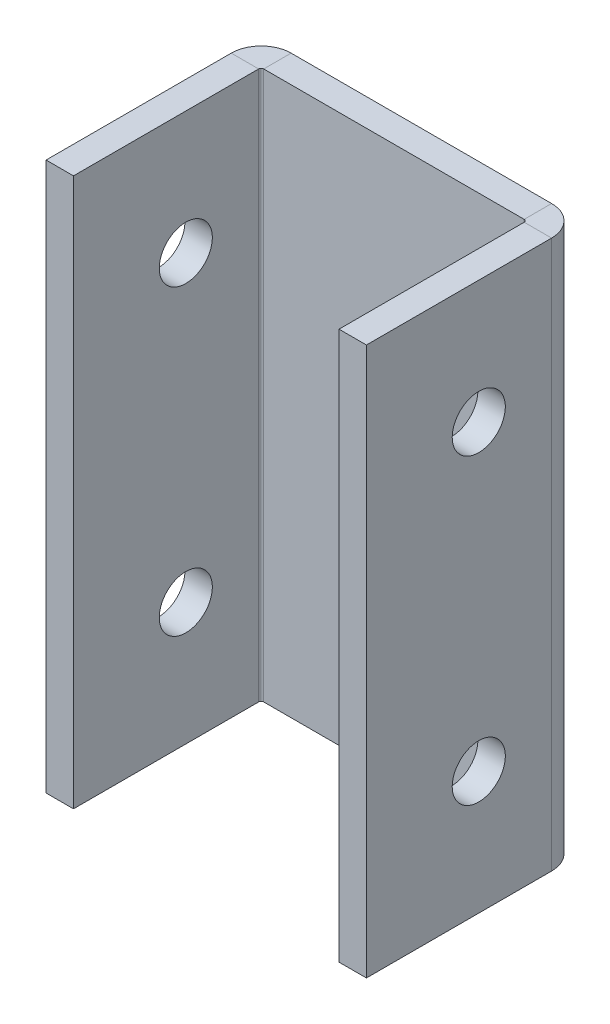
ISO-10303-21;
HEADER;
FILE_DESCRIPTION(('STEP AP214'),'2;1');
FILE_NAME('part.step','',(''),(''),'','','');
FILE_SCHEMA(('AUTOMOTIVE_DESIGN { 1 0 10303 214 1 1 1 1 }'));
ENDSEC;
DATA;
#1=APPLICATION_CONTEXT('core data for automotive mechanical design processes');
#2=APPLICATION_PROTOCOL_DEFINITION('international standard','automotive_design',2000,#1);
#3=PRODUCT_CONTEXT('',#1,'mechanical');
#4=PRODUCT('Part','Part','',(#3));
#5=PRODUCT_RELATED_PRODUCT_CATEGORY('part','',(#4));
#6=PRODUCT_DEFINITION_FORMATION('','',#4);
#7=PRODUCT_DEFINITION_CONTEXT('part definition',#1,'design');
#8=PRODUCT_DEFINITION('design','',#6,#7);
#9=PRODUCT_DEFINITION_SHAPE('','',#8);
#10=(LENGTH_UNIT() NAMED_UNIT(*) SI_UNIT(.MILLI.,.METRE.));
#11=(NAMED_UNIT(*) PLANE_ANGLE_UNIT() SI_UNIT($,.RADIAN.));
#12=(NAMED_UNIT(*) SI_UNIT($,.STERADIAN.) SOLID_ANGLE_UNIT());
#13=UNCERTAINTY_MEASURE_WITH_UNIT(LENGTH_MEASURE(1.E-05),#10,'distance_accuracy_value','');
#14=(GEOMETRIC_REPRESENTATION_CONTEXT(3) GLOBAL_UNCERTAINTY_ASSIGNED_CONTEXT((#13)) GLOBAL_UNIT_ASSIGNED_CONTEXT((#10,
#11,#12)) REPRESENTATION_CONTEXT('',''));
#15=CARTESIAN_POINT('',(0.,0.,0.));
#16=DIRECTION('',(0.,0.,1.));
#17=DIRECTION('',(1.,0.,0.));
#18=AXIS2_PLACEMENT_3D('',#15,#16,#17);
#19=CARTESIAN_POINT('',(0.,0.,0.));
#20=DIRECTION('',(0.,0.,1.));
#21=DIRECTION('',(1.,0.,0.));
#22=AXIS2_PLACEMENT_3D('',#19,#20,#21);
#23=PLANE('',#22);
#24=DIRECTION('',(-1.,0.,0.));
#25=VECTOR('',#24,1.);
#26=CARTESIAN_POINT('',(-91.3672957063712,97.1710526315789,0.));
#27=LINE('',#26,#25);
#28=CARTESIAN_POINT('',(46.1461042936288,97.1710526315789,0.));
#29=VERTEX_POINT('',#28);
#30=CARTESIAN_POINT('',(-29.8806957063713,97.1710526315789,0.));
#31=VERTEX_POINT('',#30);
#32=EDGE_CURVE('E251',#29,#31,#27,.T.);
#33=ORIENTED_EDGE('',*,*,#32,.T.);
#34=DIRECTION('',(0.,-1.,0.));
#35=VECTOR('',#34,1.);
#36=CARTESIAN_POINT('',(-29.8806957063713,0.,0.));
#37=LINE('',#36,#35);
#38=CARTESIAN_POINT('',(-29.8806957063713,-62.8289473684211,0.));
#39=VERTEX_POINT('',#38);
#40=EDGE_CURVE('E55',#31,#39,#37,.T.);
#41=ORIENTED_EDGE('',*,*,#40,.T.);
#42=DIRECTION('',(1.,0.,0.));
#43=VECTOR('',#42,1.);
#44=CARTESIAN_POINT('',(-91.3672957063712,-62.8289473684211,0.));
#45=LINE('',#44,#43);
#46=CARTESIAN_POINT('',(46.1461042936288,-62.8289473684211,0.));
#47=VERTEX_POINT('',#46);
#48=EDGE_CURVE('E71',#39,#47,#45,.T.);
#49=ORIENTED_EDGE('',*,*,#48,.T.);
#50=DIRECTION('',(0.,-1.,0.));
#51=VECTOR('',#50,1.);
#52=CARTESIAN_POINT('',(46.1461042936288,0.,0.));
#53=LINE('',#52,#51);
#54=EDGE_CURVE('E235',#29,#47,#53,.T.);
#55=ORIENTED_EDGE('',*,*,#54,.F.);
#56=EDGE_LOOP('',(#33,#41,#49,#55));
#57=FACE_BOUND('',#56,.T.);
#58=ADVANCED_FACE('F46',(#57),#23,.T.);
#59=CARTESIAN_POINT('',(-91.3672957063712,-62.8289473684211,-8.));
#60=DIRECTION('',(0.,-1.,0.));
#61=DIRECTION('',(0.,0.,-1.));
#62=AXIS2_PLACEMENT_3D('',#59,#60,#61);
#63=PLANE('',#62);
#64=ORIENTED_EDGE('',*,*,#48,.F.);
#65=DIRECTION('',(0.,0.,-1.));
#66=VECTOR('',#65,1.);
#67=CARTESIAN_POINT('',(-29.8806957063713,-62.8289473684211,-8.));
#68=LINE('',#67,#66);
#69=CARTESIAN_POINT('',(-29.8806957063713,-62.8289473684211,-8.));
#70=VERTEX_POINT('',#69);
#71=EDGE_CURVE('E243',#39,#70,#68,.T.);
#72=ORIENTED_EDGE('',*,*,#71,.T.);
#73=DIRECTION('',(1.,0.,0.));
#74=VECTOR('',#73,1.);
#75=CARTESIAN_POINT('',(-91.3672957063712,-62.8289473684211,-8.));
#76=LINE('',#75,#74);
#77=CARTESIAN_POINT('',(46.1461042936288,-62.8289473684211,-8.));
#78=VERTEX_POINT('',#77);
#79=EDGE_CURVE('E249',#70,#78,#76,.T.);
#80=ORIENTED_EDGE('',*,*,#79,.T.);
#81=DIRECTION('',(0.,0.,-1.));
#82=VECTOR('',#81,1.);
#83=CARTESIAN_POINT('',(46.1461042936288,-62.8289473684211,-8.));
#84=LINE('',#83,#82);
#85=EDGE_CURVE('E238',#47,#78,#84,.T.);
#86=ORIENTED_EDGE('',*,*,#85,.F.);
#87=EDGE_LOOP('',(#64,#72,#80,#86));
#88=FACE_BOUND('',#87,.T.);
#89=ADVANCED_FACE('F303',(#88),#63,.T.);
#90=CARTESIAN_POINT('',(-91.3672957063712,97.1710526315789,-8.));
#91=DIRECTION('',(0.,1.,0.));
#92=DIRECTION('',(0.,0.,1.));
#93=AXIS2_PLACEMENT_3D('',#90,#91,#92);
#94=PLANE('',#93);
#95=DIRECTION('',(-1.,0.,0.));
#96=VECTOR('',#95,1.);
#97=CARTESIAN_POINT('',(-91.3672957063712,97.1710526315789,-8.));
#98=LINE('',#97,#96);
#99=CARTESIAN_POINT('',(46.1461042936288,97.1710526315789,-8.));
#100=VERTEX_POINT('',#99);
#101=CARTESIAN_POINT('',(-29.8806957063713,97.1710526315789,-8.));
#102=VERTEX_POINT('',#101);
#103=EDGE_CURVE('E232',#100,#102,#98,.T.);
#104=ORIENTED_EDGE('',*,*,#103,.T.);
#105=DIRECTION('',(0.,0.,1.));
#106=VECTOR('',#105,1.);
#107=CARTESIAN_POINT('',(-29.8806957063713,97.1710526315789,-8.));
#108=LINE('',#107,#106);
#109=EDGE_CURVE('E12',#102,#31,#108,.T.);
#110=ORIENTED_EDGE('',*,*,#109,.T.);
#111=ORIENTED_EDGE('',*,*,#32,.F.);
#112=DIRECTION('',(0.,0.,1.));
#113=VECTOR('',#112,1.);
#114=CARTESIAN_POINT('',(46.1461042936288,97.1710526315789,-8.));
#115=LINE('',#114,#113);
#116=EDGE_CURVE('E231',#100,#29,#115,.T.);
#117=ORIENTED_EDGE('',*,*,#116,.F.);
#118=EDGE_LOOP('',(#104,#110,#111,#117));
#119=FACE_BOUND('',#118,.T.);
#120=ADVANCED_FACE('F48',(#119),#94,.T.);
#121=CARTESIAN_POINT('',(0.,0.,-8.));
#122=DIRECTION('',(0.,0.,1.));
#123=DIRECTION('',(1.,0.,0.));
#124=AXIS2_PLACEMENT_3D('',#121,#122,#123);
#125=PLANE('',#124);
#126=DIRECTION('',(0.,-1.,0.));
#127=VECTOR('',#126,1.);
#128=CARTESIAN_POINT('',(-29.8806957063713,0.,-8.));
#129=LINE('',#128,#127);
#130=EDGE_CURVE('E241',#102,#70,#129,.T.);
#131=ORIENTED_EDGE('',*,*,#130,.F.);
#132=ORIENTED_EDGE('',*,*,#103,.F.);
#133=DIRECTION('',(0.,-1.,0.));
#134=VECTOR('',#133,1.);
#135=CARTESIAN_POINT('',(46.1461042936288,0.,-8.));
#136=LINE('',#135,#134);
#137=EDGE_CURVE('E229',#100,#78,#136,.T.);
#138=ORIENTED_EDGE('',*,*,#137,.T.);
#139=ORIENTED_EDGE('',*,*,#79,.F.);
#140=EDGE_LOOP('',(#131,#132,#138,#139));
#141=FACE_BOUND('',#140,.T.);
#142=ADVANCED_FACE('F290',(#141),#125,.F.);
#143=CARTESIAN_POINT('',(46.1461042936288,97.1710526315789,0.7366));
#144=DIRECTION('',(0.,1.,0.));
#145=DIRECTION('',(0.,0.,1.));
#146=AXIS2_PLACEMENT_3D('',#143,#144,#145);
#147=PLANE('',#146);
#148=ORIENTED_EDGE('',*,*,#116,.T.);
#149=CARTESIAN_POINT('',(46.1461042936288,97.1710526315789,0.7366));
#150=DIRECTION('',(0.,-1.,0.));
#151=DIRECTION('',(0.,0.,-1.));
#152=AXIS2_PLACEMENT_3D('',#149,#150,#151);
#153=CIRCLE('',#152,0.7366);
#154=CARTESIAN_POINT('',(46.8827042936288,97.1710526315789,0.736599999999976));
#155=VERTEX_POINT('',#154);
#156=EDGE_CURVE('E190',#29,#155,#153,.T.);
#157=ORIENTED_EDGE('',*,*,#156,.T.);
#158=DIRECTION('',(-1.,0.,0.));
#159=VECTOR('',#158,1.);
#160=CARTESIAN_POINT('',(54.8827042936288,97.1710526315789,0.736600000000004));
#161=LINE('',#160,#159);
#162=CARTESIAN_POINT('',(54.8827042936288,97.1710526315789,0.736600000000004));
#163=VERTEX_POINT('',#162);
#164=EDGE_CURVE('E205',#163,#155,#161,.T.);
#165=ORIENTED_EDGE('',*,*,#164,.F.);
#166=CARTESIAN_POINT('',(46.1461042936288,97.1710526315789,0.7366));
#167=DIRECTION('',(0.,-1.,0.));
#168=DIRECTION('',(0.,0.,1.));
#169=AXIS2_PLACEMENT_3D('',#166,#167,#168);
#170=CIRCLE('',#169,8.7366);
#171=EDGE_CURVE('E218',#100,#163,#170,.T.);
#172=ORIENTED_EDGE('',*,*,#171,.F.);
#173=EDGE_LOOP('',(#148,#157,#165,#172));
#174=FACE_BOUND('',#173,.T.);
#175=ADVANCED_FACE('F298',(#174),#147,.T.);
#176=CARTESIAN_POINT('',(46.1461042936288,-62.8289473684211,0.7366));
#177=DIRECTION('',(0.,-1.,0.));
#178=DIRECTION('',(0.,0.,-1.));
#179=AXIS2_PLACEMENT_3D('',#176,#177,#178);
#180=PLANE('',#179);
#181=DIRECTION('',(1.,0.,0.));
#182=VECTOR('',#181,1.);
#183=CARTESIAN_POINT('',(54.8827042936288,-62.8289473684211,0.736600000000032));
#184=LINE('',#183,#182);
#185=CARTESIAN_POINT('',(46.8827042936288,-62.8289473684211,0.736600000000004));
#186=VERTEX_POINT('',#185);
#187=CARTESIAN_POINT('',(54.8827042936288,-62.8289473684211,0.736600000000037));
#188=VERTEX_POINT('',#187);
#189=EDGE_CURVE('E193',#186,#188,#184,.T.);
#190=ORIENTED_EDGE('',*,*,#189,.F.);
#191=CARTESIAN_POINT('',(46.1461042936288,-62.8289473684211,0.7366));
#192=DIRECTION('',(0.,-1.,0.));
#193=DIRECTION('',(0.,0.,-1.));
#194=AXIS2_PLACEMENT_3D('',#191,#192,#193);
#195=CIRCLE('',#194,0.7366);
#196=EDGE_CURVE('E222',#186,#47,#195,.F.);
#197=ORIENTED_EDGE('',*,*,#196,.T.);
#198=ORIENTED_EDGE('',*,*,#85,.T.);
#199=CARTESIAN_POINT('',(46.1461042936288,-62.8289473684211,0.7366));
#200=DIRECTION('',(0.,1.,0.));
#201=DIRECTION('',(0.,0.,-1.));
#202=AXIS2_PLACEMENT_3D('',#199,#200,#201);
#203=CIRCLE('',#202,8.7366);
#204=EDGE_CURVE('E221',#188,#78,#203,.T.);
#205=ORIENTED_EDGE('',*,*,#204,.F.);
#206=EDGE_LOOP('',(#190,#197,#198,#205));
#207=FACE_BOUND('',#206,.T.);
#208=ADVANCED_FACE('F306',(#207),#180,.T.);
#209=CARTESIAN_POINT('',(46.1461042936288,177.543609760944,0.7366));
#210=DIRECTION('',(0.,-1.,0.));
#211=DIRECTION('',(0.,0.,-1.));
#212=AXIS2_PLACEMENT_3D('',#209,#210,#211);
#213=CYLINDRICAL_SURFACE('',#212,8.7366);
#214=ORIENTED_EDGE('',*,*,#204,.T.);
#215=ORIENTED_EDGE('',*,*,#137,.F.);
#216=ORIENTED_EDGE('',*,*,#171,.T.);
#217=DIRECTION('',(0.,-1.,0.));
#218=VECTOR('',#217,1.);
#219=CARTESIAN_POINT('',(54.8827042936288,0.,0.736600000000018));
#220=LINE('',#219,#218);
#221=EDGE_CURVE('E183',#163,#188,#220,.T.);
#222=ORIENTED_EDGE('',*,*,#221,.T.);
#223=EDGE_LOOP('',(#214,#215,#216,#222));
#224=FACE_BOUND('',#223,.T.);
#225=ADVANCED_FACE('F300',(#224),#213,.T.);
#226=CARTESIAN_POINT('',(46.1461042936288,177.543609760944,0.7366));
#227=DIRECTION('',(0.,-1.,0.));
#228=DIRECTION('',(0.,0.,-1.));
#229=AXIS2_PLACEMENT_3D('',#226,#227,#228);
#230=CYLINDRICAL_SURFACE('',#229,0.7366);
#231=ORIENTED_EDGE('',*,*,#196,.F.);
#232=DIRECTION('',(0.,-1.,0.));
#233=VECTOR('',#232,1.);
#234=CARTESIAN_POINT('',(46.8827042936288,0.,0.73659999999999));
#235=LINE('',#234,#233);
#236=EDGE_CURVE('E200',#155,#186,#235,.T.);
#237=ORIENTED_EDGE('',*,*,#236,.F.);
#238=ORIENTED_EDGE('',*,*,#156,.F.);
#239=ORIENTED_EDGE('',*,*,#54,.T.);
#240=EDGE_LOOP('',(#231,#237,#238,#239));
#241=FACE_BOUND('',#240,.T.);
#242=ADVANCED_FACE('F310',(#241),#230,.F.);
#243=CARTESIAN_POINT('',(54.8827042936286,97.1710526315789,54.7829661185033));
#244=DIRECTION('',(0.,0.,1.));
#245=DIRECTION('',(0.,1.,0.));
#246=AXIS2_PLACEMENT_3D('',#243,#244,#245);
#247=PLANE('',#246);
#248=DIRECTION('',(0.,1.,0.));
#249=VECTOR('',#248,1.);
#250=CARTESIAN_POINT('',(46.8827042936286,97.1710526315789,54.7829661185033));
#251=LINE('',#250,#249);
#252=CARTESIAN_POINT('',(46.8827042936286,-62.8289473684211,54.7829661185033));
#253=VERTEX_POINT('',#252);
#254=CARTESIAN_POINT('',(46.8827042936286,97.1710526315789,54.7829661185033));
#255=VERTEX_POINT('',#254);
#256=EDGE_CURVE('E195',#253,#255,#251,.T.);
#257=ORIENTED_EDGE('',*,*,#256,.F.);
#258=DIRECTION('',(-1.,0.,0.));
#259=VECTOR('',#258,1.);
#260=CARTESIAN_POINT('',(54.8827042936286,-62.8289473684211,54.7829661185033));
#261=LINE('',#260,#259);
#262=CARTESIAN_POINT('',(54.8827042936286,-62.8289473684211,54.7829661185033));
#263=VERTEX_POINT('',#262);
#264=EDGE_CURVE('E187',#263,#253,#261,.T.);
#265=ORIENTED_EDGE('',*,*,#264,.F.);
#266=DIRECTION('',(0.,1.,0.));
#267=VECTOR('',#266,1.);
#268=CARTESIAN_POINT('',(54.8827042936286,97.1710526315789,54.7829661185033));
#269=LINE('',#268,#267);
#270=CARTESIAN_POINT('',(54.8827042936286,97.1710526315789,54.7829661185033));
#271=VERTEX_POINT('',#270);
#272=EDGE_CURVE('E213',#263,#271,#269,.T.);
#273=ORIENTED_EDGE('',*,*,#272,.T.);
#274=DIRECTION('',(-1.,0.,0.));
#275=VECTOR('',#274,1.);
#276=CARTESIAN_POINT('',(54.8827042936286,97.1710526315789,54.7829661185033));
#277=LINE('',#276,#275);
#278=EDGE_CURVE('E211',#271,#255,#277,.T.);
#279=ORIENTED_EDGE('',*,*,#278,.T.);
#280=EDGE_LOOP('',(#257,#265,#273,#279));
#281=FACE_BOUND('',#280,.T.);
#282=ADVANCED_FACE('F343',(#281),#247,.T.);
#283=CARTESIAN_POINT('',(54.882704293629,0.,-52.8497381751255));
#284=DIRECTION('',(-1.,0.,0.));
#285=DIRECTION('',(0.,0.,1.));
#286=AXIS2_PLACEMENT_3D('',#283,#284,#285);
#287=PLANE('',#286);
#288=CARTESIAN_POINT('',(54.8827042936289,-26.9789473684211,21.9999999999997));
#289=DIRECTION('',(-1.,0.,0.));
#290=DIRECTION('',(0.,0.,1.));
#291=AXIS2_PLACEMENT_3D('',#288,#289,#290);
#292=CIRCLE('',#291,7.74999999999998);
#293=CARTESIAN_POINT('',(54.8827042936289,-26.9789473684211,29.7499999999997));
#294=VERTEX_POINT('',#293);
#295=EDGE_CURVE('E598',#294,#294,#292,.T.);
#296=ORIENTED_EDGE('',*,*,#295,.T.);
#297=EDGE_LOOP('',(#296));
#298=FACE_BOUND('',#297,.T.);
#299=CARTESIAN_POINT('',(54.8827042936289,61.3210526315789,21.9999999999997));
#300=DIRECTION('',(-1.,0.,0.));
#301=DIRECTION('',(0.,0.,1.));
#302=AXIS2_PLACEMENT_3D('',#299,#300,#301);
#303=CIRCLE('',#302,7.74999999999998);
#304=CARTESIAN_POINT('',(54.8827042936289,61.3210526315789,29.7499999999997));
#305=VERTEX_POINT('',#304);
#306=EDGE_CURVE('E257',#305,#305,#303,.T.);
#307=ORIENTED_EDGE('',*,*,#306,.T.);
#308=EDGE_LOOP('',(#307));
#309=FACE_BOUND('',#308,.T.);
#310=ORIENTED_EDGE('',*,*,#221,.F.);
#311=DIRECTION('',(0.,0.,-1.));
#312=VECTOR('',#311,1.);
#313=CARTESIAN_POINT('',(54.8827042936293,97.1710526315789,-144.217033881497));
#314=LINE('',#313,#312);
#315=EDGE_CURVE('E208',#271,#163,#314,.T.);
#316=ORIENTED_EDGE('',*,*,#315,.F.);
#317=ORIENTED_EDGE('',*,*,#272,.F.);
#318=DIRECTION('',(0.,0.,1.));
#319=VECTOR('',#318,1.);
#320=CARTESIAN_POINT('',(54.8827042936293,-62.8289473684211,-144.217033881497));
#321=LINE('',#320,#319);
#322=EDGE_CURVE('E191',#188,#263,#321,.T.);
#323=ORIENTED_EDGE('',*,*,#322,.F.);
#324=EDGE_LOOP('',(#310,#316,#317,#323));
#325=FACE_BOUND('',#324,.T.);
#326=ADVANCED_FACE('F352',(#298,#309,#325),#287,.F.);
#327=CARTESIAN_POINT('',(54.8827042936293,97.1710526315789,-144.217033881497));
#328=DIRECTION('',(0.,1.,0.));
#329=DIRECTION('',(-1.,0.,0.));
#330=AXIS2_PLACEMENT_3D('',#327,#328,#329);
#331=PLANE('',#330);
#332=ORIENTED_EDGE('',*,*,#315,.T.);
#333=ORIENTED_EDGE('',*,*,#164,.T.);
#334=DIRECTION('',(0.,0.,-1.));
#335=VECTOR('',#334,1.);
#336=CARTESIAN_POINT('',(46.8827042936293,97.1710526315789,-144.217033881497));
#337=LINE('',#336,#335);
#338=EDGE_CURVE('E203',#255,#155,#337,.T.);
#339=ORIENTED_EDGE('',*,*,#338,.F.);
#340=ORIENTED_EDGE('',*,*,#278,.F.);
#341=EDGE_LOOP('',(#332,#333,#339,#340));
#342=FACE_BOUND('',#341,.T.);
#343=ADVANCED_FACE('F348',(#342),#331,.T.);
#344=CARTESIAN_POINT('',(46.882704293629,0.,-52.8497381751255));
#345=DIRECTION('',(-1.,0.,0.));
#346=DIRECTION('',(0.,0.,1.));
#347=AXIS2_PLACEMENT_3D('',#344,#345,#346);
#348=PLANE('',#347);
#349=CARTESIAN_POINT('',(46.8827042936287,-26.9789473684211,21.9999999999997));
#350=DIRECTION('',(-1.,0.,0.));
#351=DIRECTION('',(0.,0.,1.));
#352=AXIS2_PLACEMENT_3D('',#349,#350,#351);
#353=CIRCLE('',#352,7.74999999999998);
#354=CARTESIAN_POINT('',(46.8827042936287,-26.9789473684211,29.7499999999997));
#355=VERTEX_POINT('',#354);
#356=EDGE_CURVE('E268',#355,#355,#353,.T.);
#357=ORIENTED_EDGE('',*,*,#356,.F.);
#358=EDGE_LOOP('',(#357));
#359=FACE_BOUND('',#358,.T.);
#360=CARTESIAN_POINT('',(46.8827042936287,61.3210526315789,21.9999999999997));
#361=DIRECTION('',(-1.,0.,0.));
#362=DIRECTION('',(0.,0.,1.));
#363=AXIS2_PLACEMENT_3D('',#360,#361,#362);
#364=CIRCLE('',#363,7.74999999999999);
#365=CARTESIAN_POINT('',(46.8827042936287,61.3210526315789,29.7499999999997));
#366=VERTEX_POINT('',#365);
#367=EDGE_CURVE('E175',#366,#366,#364,.T.);
#368=ORIENTED_EDGE('',*,*,#367,.F.);
#369=EDGE_LOOP('',(#368));
#370=FACE_BOUND('',#369,.T.);
#371=ORIENTED_EDGE('',*,*,#338,.T.);
#372=ORIENTED_EDGE('',*,*,#236,.T.);
#373=DIRECTION('',(0.,0.,1.));
#374=VECTOR('',#373,1.);
#375=CARTESIAN_POINT('',(46.8827042936293,-62.8289473684211,-144.217033881497));
#376=LINE('',#375,#374);
#377=EDGE_CURVE('E198',#186,#253,#376,.T.);
#378=ORIENTED_EDGE('',*,*,#377,.T.);
#379=ORIENTED_EDGE('',*,*,#256,.T.);
#380=EDGE_LOOP('',(#371,#372,#378,#379));
#381=FACE_BOUND('',#380,.T.);
#382=ADVANCED_FACE('F325',(#359,#370,#381),#348,.T.);
#383=CARTESIAN_POINT('',(54.8827042936293,-62.8289473684211,-144.217033881497));
#384=DIRECTION('',(0.,-1.,0.));
#385=DIRECTION('',(1.,0.,0.));
#386=AXIS2_PLACEMENT_3D('',#383,#384,#385);
#387=PLANE('',#386);
#388=ORIENTED_EDGE('',*,*,#377,.F.);
#389=ORIENTED_EDGE('',*,*,#189,.T.);
#390=ORIENTED_EDGE('',*,*,#322,.T.);
#391=ORIENTED_EDGE('',*,*,#264,.T.);
#392=EDGE_LOOP('',(#388,#389,#390,#391));
#393=FACE_BOUND('',#392,.T.);
#394=ADVANCED_FACE('F318',(#393),#387,.T.);
#395=CARTESIAN_POINT('',(-29.8806957063713,97.1710526315789,0.7366));
#396=DIRECTION('',(0.,1.,0.));
#397=DIRECTION('',(0.,0.,1.));
#398=AXIS2_PLACEMENT_3D('',#395,#396,#397);
#399=PLANE('',#398);
#400=DIRECTION('',(1.,0.,0.));
#401=VECTOR('',#400,1.);
#402=CARTESIAN_POINT('',(-38.6172957063713,97.1710526315789,0.736600000000032));
#403=LINE('',#402,#401);
#404=CARTESIAN_POINT('',(-38.6172957063713,97.1710526315789,0.736600000000037));
#405=VERTEX_POINT('',#404);
#406=CARTESIAN_POINT('',(-30.6172957063713,97.1710526315789,0.736600000000004));
#407=VERTEX_POINT('',#406);
#408=EDGE_CURVE('E145',#405,#407,#403,.T.);
#409=ORIENTED_EDGE('',*,*,#408,.T.);
#410=CARTESIAN_POINT('',(-29.8806957063713,97.1710526315789,0.7366));
#411=DIRECTION('',(0.,1.,0.));
#412=DIRECTION('',(0.,0.,1.));
#413=AXIS2_PLACEMENT_3D('',#410,#411,#412);
#414=CIRCLE('',#413,0.7366);
#415=EDGE_CURVE('E63',#407,#31,#414,.F.);
#416=ORIENTED_EDGE('',*,*,#415,.T.);
#417=ORIENTED_EDGE('',*,*,#109,.F.);
#418=CARTESIAN_POINT('',(-29.8806957063713,97.1710526315789,0.7366));
#419=DIRECTION('',(0.,-1.,0.));
#420=DIRECTION('',(0.,0.,1.));
#421=AXIS2_PLACEMENT_3D('',#418,#419,#420);
#422=CIRCLE('',#421,8.7366);
#423=EDGE_CURVE('E176',#405,#102,#422,.T.);
#424=ORIENTED_EDGE('',*,*,#423,.F.);
#425=EDGE_LOOP('',(#409,#416,#417,#424));
#426=FACE_BOUND('',#425,.T.);
#427=ADVANCED_FACE('F316',(#426),#399,.T.);
#428=CARTESIAN_POINT('',(-29.8806957063713,-62.8289473684211,0.7366));
#429=DIRECTION('',(0.,-1.,0.));
#430=DIRECTION('',(0.,0.,-1.));
#431=AXIS2_PLACEMENT_3D('',#428,#429,#430);
#432=PLANE('',#431);
#433=CARTESIAN_POINT('',(-29.8806957063713,-62.8289473684211,0.7366));
#434=DIRECTION('',(0.,1.,0.));
#435=DIRECTION('',(0.,0.,1.));
#436=AXIS2_PLACEMENT_3D('',#433,#434,#435);
#437=CIRCLE('',#436,0.7366);
#438=CARTESIAN_POINT('',(-30.6172957063713,-62.8289473684211,0.736600000000004));
#439=VERTEX_POINT('',#438);
#440=EDGE_CURVE('E180',#39,#439,#437,.T.);
#441=ORIENTED_EDGE('',*,*,#440,.T.);
#442=DIRECTION('',(-1.,0.,0.));
#443=VECTOR('',#442,1.);
#444=CARTESIAN_POINT('',(-38.6172957063713,-62.8289473684211,0.736600000000032));
#445=LINE('',#444,#443);
#446=CARTESIAN_POINT('',(-38.6172957063713,-62.8289473684211,0.736600000000032));
#447=VERTEX_POINT('',#446);
#448=EDGE_CURVE('E163',#439,#447,#445,.T.);
#449=ORIENTED_EDGE('',*,*,#448,.T.);
#450=CARTESIAN_POINT('',(-29.8806957063713,-62.8289473684211,0.7366));
#451=DIRECTION('',(0.,1.,0.));
#452=DIRECTION('',(0.,0.,-1.));
#453=AXIS2_PLACEMENT_3D('',#450,#451,#452);
#454=CIRCLE('',#453,8.7366);
#455=EDGE_CURVE('E179',#70,#447,#454,.T.);
#456=ORIENTED_EDGE('',*,*,#455,.F.);
#457=ORIENTED_EDGE('',*,*,#71,.F.);
#458=EDGE_LOOP('',(#441,#449,#456,#457));
#459=FACE_BOUND('',#458,.T.);
#460=ADVANCED_FACE('F284',(#459),#432,.T.);
#461=CARTESIAN_POINT('',(-29.8806957063713,-143.201504497786,0.7366));
#462=DIRECTION('',(0.,1.,0.));
#463=DIRECTION('',(0.,0.,1.));
#464=AXIS2_PLACEMENT_3D('',#461,#462,#463);
#465=CYLINDRICAL_SURFACE('',#464,8.7366);
#466=ORIENTED_EDGE('',*,*,#130,.T.);
#467=ORIENTED_EDGE('',*,*,#455,.T.);
#468=DIRECTION('',(0.,-1.,0.));
#469=VECTOR('',#468,1.);
#470=CARTESIAN_POINT('',(-38.6172957063713,0.,0.736600000000032));
#471=LINE('',#470,#469);
#472=EDGE_CURVE('E165',#405,#447,#471,.T.);
#473=ORIENTED_EDGE('',*,*,#472,.F.);
#474=ORIENTED_EDGE('',*,*,#423,.T.);
#475=EDGE_LOOP('',(#466,#467,#473,#474));
#476=FACE_BOUND('',#475,.T.);
#477=ADVANCED_FACE('F287',(#476),#465,.T.);
#478=CARTESIAN_POINT('',(-29.8806957063713,-143.201504497786,0.7366));
#479=DIRECTION('',(0.,1.,0.));
#480=DIRECTION('',(0.,0.,1.));
#481=AXIS2_PLACEMENT_3D('',#478,#479,#480);
#482=CYLINDRICAL_SURFACE('',#481,0.7366);
#483=ORIENTED_EDGE('',*,*,#40,.F.);
#484=ORIENTED_EDGE('',*,*,#415,.F.);
#485=DIRECTION('',(0.,-1.,0.));
#486=VECTOR('',#485,1.);
#487=CARTESIAN_POINT('',(-30.6172957063713,0.,0.736600000000004));
#488=LINE('',#487,#486);
#489=EDGE_CURVE('E168',#407,#439,#488,.T.);
#490=ORIENTED_EDGE('',*,*,#489,.T.);
#491=ORIENTED_EDGE('',*,*,#440,.F.);
#492=EDGE_LOOP('',(#483,#484,#490,#491));
#493=FACE_BOUND('',#492,.T.);
#494=ADVANCED_FACE('F312',(#493),#482,.F.);
#495=CARTESIAN_POINT('',(-38.6172957063711,97.1710526315789,54.7829661185033));
#496=DIRECTION('',(0.,0.,1.));
#497=DIRECTION('',(0.,-1.,0.));
#498=AXIS2_PLACEMENT_3D('',#495,#496,#497);
#499=PLANE('',#498);
#500=DIRECTION('',(0.,-1.,0.));
#501=VECTOR('',#500,1.);
#502=CARTESIAN_POINT('',(-30.6172957063711,97.1710526315789,54.7829661185032));
#503=LINE('',#502,#501);
#504=CARTESIAN_POINT('',(-30.6172957063711,97.1710526315789,54.7829661185032));
#505=VERTEX_POINT('',#504);
#506=CARTESIAN_POINT('',(-30.6172957063711,-62.8289473684211,54.7829661185032));
#507=VERTEX_POINT('',#506);
#508=EDGE_CURVE('E156',#505,#507,#503,.T.);
#509=ORIENTED_EDGE('',*,*,#508,.F.);
#510=DIRECTION('',(1.,0.,0.));
#511=VECTOR('',#510,1.);
#512=CARTESIAN_POINT('',(-38.6172957063711,97.1710526315789,54.7829661185033));
#513=LINE('',#512,#511);
#514=CARTESIAN_POINT('',(-38.6172957063711,97.1710526315789,54.7829661185033));
#515=VERTEX_POINT('',#514);
#516=EDGE_CURVE('E143',#515,#505,#513,.T.);
#517=ORIENTED_EDGE('',*,*,#516,.F.);
#518=DIRECTION('',(0.,-1.,0.));
#519=VECTOR('',#518,1.);
#520=CARTESIAN_POINT('',(-38.6172957063711,97.1710526315789,54.7829661185033));
#521=LINE('',#520,#519);
#522=CARTESIAN_POINT('',(-38.6172957063711,-62.8289473684211,54.7829661185032));
#523=VERTEX_POINT('',#522);
#524=EDGE_CURVE('E154',#515,#523,#521,.T.);
#525=ORIENTED_EDGE('',*,*,#524,.T.);
#526=DIRECTION('',(1.,0.,0.));
#527=VECTOR('',#526,1.);
#528=CARTESIAN_POINT('',(-38.6172957063711,-62.8289473684211,54.7829661185032));
#529=LINE('',#528,#527);
#530=EDGE_CURVE('E162',#523,#507,#529,.T.);
#531=ORIENTED_EDGE('',*,*,#530,.T.);
#532=EDGE_LOOP('',(#509,#517,#525,#531));
#533=FACE_BOUND('',#532,.T.);
#534=ADVANCED_FACE('F153',(#533),#499,.T.);
#535=CARTESIAN_POINT('',(-38.6172957063714,0.,-36.584329587868));
#536=DIRECTION('',(1.,0.,0.));
#537=DIRECTION('',(0.,0.,-1.));
#538=AXIS2_PLACEMENT_3D('',#535,#536,#537);
#539=PLANE('',#538);
#540=CARTESIAN_POINT('',(-38.6172957063712,-26.9789473684211,22.));
#541=DIRECTION('',(-1.,0.,0.));
#542=DIRECTION('',(0.,0.,1.));
#543=AXIS2_PLACEMENT_3D('',#540,#541,#542);
#544=CIRCLE('',#543,7.74999999999999);
#545=CARTESIAN_POINT('',(-38.6172957063712,-26.9789473684211,29.75));
#546=VERTEX_POINT('',#545);
#547=EDGE_CURVE('E594',#546,#546,#544,.T.);
#548=ORIENTED_EDGE('',*,*,#547,.F.);
#549=EDGE_LOOP('',(#548));
#550=FACE_BOUND('',#549,.T.);
#551=CARTESIAN_POINT('',(-38.6172957063712,61.3210526315789,22.));
#552=DIRECTION('',(-1.,0.,0.));
#553=DIRECTION('',(0.,0.,1.));
#554=AXIS2_PLACEMENT_3D('',#551,#552,#553);
#555=CIRCLE('',#554,7.74999999999999);
#556=CARTESIAN_POINT('',(-38.6172957063712,61.3210526315789,29.75));
#557=VERTEX_POINT('',#556);
#558=EDGE_CURVE('E263',#557,#557,#555,.T.);
#559=ORIENTED_EDGE('',*,*,#558,.F.);
#560=EDGE_LOOP('',(#559));
#561=FACE_BOUND('',#560,.T.);
#562=DIRECTION('',(0.,0.,1.));
#563=VECTOR('',#562,1.);
#564=CARTESIAN_POINT('',(-38.6172957063711,97.1710526315789,54.7829661185033));
#565=LINE('',#564,#563);
#566=EDGE_CURVE('E140',#405,#515,#565,.T.);
#567=ORIENTED_EDGE('',*,*,#566,.F.);
#568=ORIENTED_EDGE('',*,*,#472,.T.);
#569=DIRECTION('',(0.,0.,-1.));
#570=VECTOR('',#569,1.);
#571=CARTESIAN_POINT('',(-38.6172957063711,-62.8289473684211,54.7829661185032));
#572=LINE('',#571,#570);
#573=EDGE_CURVE('E161',#523,#447,#572,.T.);
#574=ORIENTED_EDGE('',*,*,#573,.F.);
#575=ORIENTED_EDGE('',*,*,#524,.F.);
#576=EDGE_LOOP('',(#567,#568,#574,#575));
#577=FACE_BOUND('',#576,.T.);
#578=ADVANCED_FACE('F159',(#550,#561,#577),#539,.F.);
#579=CARTESIAN_POINT('',(-38.6172957063711,-62.8289473684211,54.7829661185032));
#580=DIRECTION('',(0.,-1.,0.));
#581=DIRECTION('',(-1.,0.,0.));
#582=AXIS2_PLACEMENT_3D('',#579,#580,#581);
#583=PLANE('',#582);
#584=ORIENTED_EDGE('',*,*,#448,.F.);
#585=DIRECTION('',(0.,0.,-1.));
#586=VECTOR('',#585,1.);
#587=CARTESIAN_POINT('',(-30.6172957063711,-62.8289473684211,54.7829661185032));
#588=LINE('',#587,#586);
#589=EDGE_CURVE('E149',#507,#439,#588,.T.);
#590=ORIENTED_EDGE('',*,*,#589,.F.);
#591=ORIENTED_EDGE('',*,*,#530,.F.);
#592=ORIENTED_EDGE('',*,*,#573,.T.);
#593=EDGE_LOOP('',(#584,#590,#591,#592));
#594=FACE_BOUND('',#593,.T.);
#595=ADVANCED_FACE('F280',(#594),#583,.T.);
#596=CARTESIAN_POINT('',(-30.6172957063714,0.,-36.584329587868));
#597=DIRECTION('',(1.,0.,0.));
#598=DIRECTION('',(0.,0.,-1.));
#599=AXIS2_PLACEMENT_3D('',#596,#597,#598);
#600=PLANE('',#599);
#601=CARTESIAN_POINT('',(-30.6172957063712,-26.9789473684211,22.));
#602=DIRECTION('',(1.,0.,0.));
#603=DIRECTION('',(0.,0.,-1.));
#604=AXIS2_PLACEMENT_3D('',#601,#602,#603);
#605=CIRCLE('',#604,7.74999999999998);
#606=CARTESIAN_POINT('',(-30.6172957063712,-26.9789473684211,14.25));
#607=VERTEX_POINT('',#606);
#608=EDGE_CURVE('E50',#607,#607,#605,.T.);
#609=ORIENTED_EDGE('',*,*,#608,.F.);
#610=EDGE_LOOP('',(#609));
#611=FACE_BOUND('',#610,.T.);
#612=CARTESIAN_POINT('',(-30.6172957063712,61.3210526315789,22.));
#613=DIRECTION('',(1.,0.,0.));
#614=DIRECTION('',(0.,0.,-1.));
#615=AXIS2_PLACEMENT_3D('',#612,#613,#614);
#616=CIRCLE('',#615,7.74999999999999);
#617=CARTESIAN_POINT('',(-30.6172957063712,61.3210526315789,14.25));
#618=VERTEX_POINT('',#617);
#619=EDGE_CURVE('E255',#618,#618,#616,.T.);
#620=ORIENTED_EDGE('',*,*,#619,.F.);
#621=EDGE_LOOP('',(#620));
#622=FACE_BOUND('',#621,.T.);
#623=ORIENTED_EDGE('',*,*,#489,.F.);
#624=DIRECTION('',(0.,0.,1.));
#625=VECTOR('',#624,1.);
#626=CARTESIAN_POINT('',(-30.6172957063711,97.1710526315789,54.7829661185032));
#627=LINE('',#626,#625);
#628=EDGE_CURVE('E274',#407,#505,#627,.T.);
#629=ORIENTED_EDGE('',*,*,#628,.T.);
#630=ORIENTED_EDGE('',*,*,#508,.T.);
#631=ORIENTED_EDGE('',*,*,#589,.T.);
#632=EDGE_LOOP('',(#623,#629,#630,#631));
#633=FACE_BOUND('',#632,.T.);
#634=ADVANCED_FACE('F315',(#611,#622,#633),#600,.T.);
#635=CARTESIAN_POINT('',(-38.6172957063711,97.1710526315789,54.7829661185033));
#636=DIRECTION('',(0.,1.,0.));
#637=DIRECTION('',(1.,0.,0.));
#638=AXIS2_PLACEMENT_3D('',#635,#636,#637);
#639=PLANE('',#638);
#640=ORIENTED_EDGE('',*,*,#408,.F.);
#641=ORIENTED_EDGE('',*,*,#566,.T.);
#642=ORIENTED_EDGE('',*,*,#516,.T.);
#643=ORIENTED_EDGE('',*,*,#628,.F.);
#644=EDGE_LOOP('',(#640,#641,#642,#643));
#645=FACE_BOUND('',#644,.T.);
#646=ADVANCED_FACE('F142',(#645),#639,.T.);
#647=CARTESIAN_POINT('',(-38.6172957063712,61.3210526315789,22.));
#648=DIRECTION('',(-1.,0.,0.));
#649=DIRECTION('',(0.,0.,1.));
#650=AXIS2_PLACEMENT_3D('',#647,#648,#649);
#651=CYLINDRICAL_SURFACE('',#650,7.74999999999999);
#652=ORIENTED_EDGE('',*,*,#619,.T.);
#653=EDGE_LOOP('',(#652));
#654=FACE_BOUND('',#653,.T.);
#655=ORIENTED_EDGE('',*,*,#558,.T.);
#656=EDGE_LOOP('',(#655));
#657=FACE_BOUND('',#656,.T.);
#658=ADVANCED_FACE('F447',(#654,#657),#651,.F.);
#659=ORIENTED_EDGE('',*,*,#367,.T.);
#660=EDGE_LOOP('',(#659));
#661=FACE_BOUND('',#660,.T.);
#662=ORIENTED_EDGE('',*,*,#306,.F.);
#663=EDGE_LOOP('',(#662));
#664=FACE_BOUND('',#663,.T.);
#665=ADVANCED_FACE('F460',(#661,#664),#651,.F.);
#666=CARTESIAN_POINT('',(-38.6172957063712,-26.9789473684211,22.));
#667=DIRECTION('',(-1.,0.,0.));
#668=DIRECTION('',(0.,0.,1.));
#669=AXIS2_PLACEMENT_3D('',#666,#667,#668);
#670=CYLINDRICAL_SURFACE('',#669,7.74999999999998);
#671=ORIENTED_EDGE('',*,*,#608,.T.);
#672=EDGE_LOOP('',(#671));
#673=FACE_BOUND('',#672,.T.);
#674=ORIENTED_EDGE('',*,*,#547,.T.);
#675=EDGE_LOOP('',(#674));
#676=FACE_BOUND('',#675,.T.);
#677=ADVANCED_FACE('F467',(#673,#676),#670,.F.);
#678=ORIENTED_EDGE('',*,*,#356,.T.);
#679=EDGE_LOOP('',(#678));
#680=FACE_BOUND('',#679,.T.);
#681=ORIENTED_EDGE('',*,*,#295,.F.);
#682=EDGE_LOOP('',(#681));
#683=FACE_BOUND('',#682,.T.);
#684=ADVANCED_FACE('F474',(#680,#683),#670,.F.);
#685=CLOSED_SHELL('',(#58,#89,#120,#142,#175,#208,#225,#242,#282,#326,#343,#382,#394,#427,#460,
#477,#494,#534,#578,#595,#634,#646,#658,#665,#677,#684));
#686=MANIFOLD_SOLID_BREP('B2',#685);
#687=ADVANCED_BREP_SHAPE_REPRESENTATION('',(#18,#686),#14);
#688=SHAPE_DEFINITION_REPRESENTATION(#9,#687);
ENDSEC;
END-ISO-10303-21;
